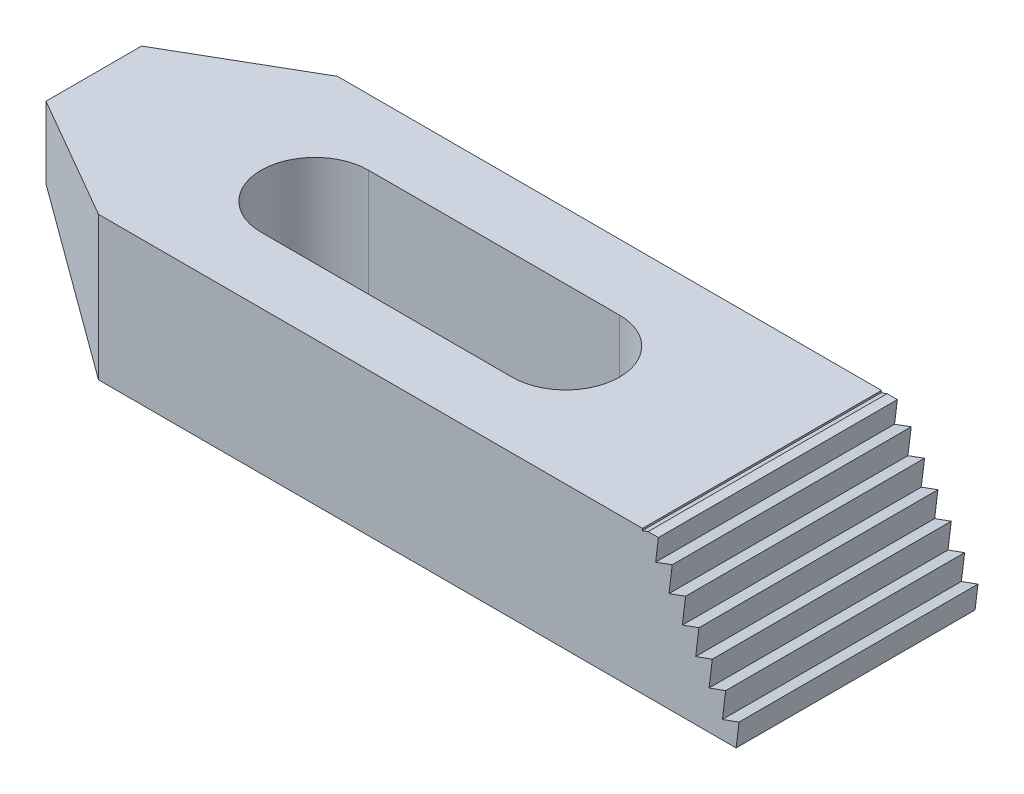
ISO-10303-21;
HEADER;
FILE_DESCRIPTION(('STEP AP214'),'2;1');
FILE_NAME('part.step','',(''),(''),'','','');
FILE_SCHEMA(('AUTOMOTIVE_DESIGN { 1 0 10303 214 1 1 1 1 }'));
ENDSEC;
DATA;
#1=APPLICATION_CONTEXT('core data for automotive mechanical design processes');
#2=APPLICATION_PROTOCOL_DEFINITION('international standard','automotive_design',2000,#1);
#3=PRODUCT_CONTEXT('',#1,'mechanical');
#4=PRODUCT('Part','Part','',(#3));
#5=PRODUCT_RELATED_PRODUCT_CATEGORY('part','',(#4));
#6=PRODUCT_DEFINITION_FORMATION('','',#4);
#7=PRODUCT_DEFINITION_CONTEXT('part definition',#1,'design');
#8=PRODUCT_DEFINITION('design','',#6,#7);
#9=PRODUCT_DEFINITION_SHAPE('','',#8);
#10=(LENGTH_UNIT() NAMED_UNIT(*) SI_UNIT(.MILLI.,.METRE.));
#11=(NAMED_UNIT(*) PLANE_ANGLE_UNIT() SI_UNIT($,.RADIAN.));
#12=(NAMED_UNIT(*) SI_UNIT($,.STERADIAN.) SOLID_ANGLE_UNIT());
#13=UNCERTAINTY_MEASURE_WITH_UNIT(LENGTH_MEASURE(1.E-05),#10,'distance_accuracy_value','');
#14=(GEOMETRIC_REPRESENTATION_CONTEXT(3) GLOBAL_UNCERTAINTY_ASSIGNED_CONTEXT((#13)) GLOBAL_UNIT_ASSIGNED_CONTEXT((#10,
#11,#12)) REPRESENTATION_CONTEXT('',''));
#15=CARTESIAN_POINT('',(0.,0.,0.));
#16=DIRECTION('',(0.,0.,1.));
#17=DIRECTION('',(1.,0.,0.));
#18=AXIS2_PLACEMENT_3D('',#15,#16,#17);
#19=CARTESIAN_POINT('',(16.5051291881549,9.24292269619013,25.4000000000063));
#20=DIRECTION('',(-0.34202014332444,0.939692620786356,6.42338198795155E-13));
#21=DIRECTION('',(0.939692620786356,0.34202014332444,2.33755980176246E-13));
#22=AXIS2_PLACEMENT_3D('',#19,#20,#21);
#23=PLANE('',#22);
#24=DIRECTION('',(0.,-6.83456763406199E-13,1.));
#25=VECTOR('',#24,1.);
#26=CARTESIAN_POINT('',(17.2801302107477,9.52499999994403,17.4625000000065));
#27=LINE('',#26,#25);
#28=CARTESIAN_POINT('',(17.2801302107477,9.52499999996031,-6.34999999999348));
#29=VERTEX_POINT('',#28);
#30=CARTESIAN_POINT('',(17.2801302107477,9.52499999993861,25.4000000000065));
#31=VERTEX_POINT('',#30);
#32=EDGE_CURVE('E11',#29,#31,#27,.T.);
#33=ORIENTED_EDGE('',*,*,#32,.F.);
#34=DIRECTION('',(0.939692620786356,0.34202014332444,2.33755980176246E-13));
#35=VECTOR('',#34,1.);
#36=CARTESIAN_POINT('',(-1.7323163683359,2.60503536462578,-6.34999999999821));
#37=LINE('',#36,#35);
#38=CARTESIAN_POINT('',(16.505129188155,9.24292269621183,-6.34999999999368));
#39=VERTEX_POINT('',#38);
#40=EDGE_CURVE('E55',#39,#29,#37,.T.);
#41=ORIENTED_EDGE('',*,*,#40,.F.);
#42=DIRECTION('',(0.,6.83566958165254E-13,-1.));
#43=VECTOR('',#42,1.);
#44=CARTESIAN_POINT('',(16.5051291881549,9.24292269619013,25.4000000000063));
#45=LINE('',#44,#43);
#46=CARTESIAN_POINT('',(16.5051291881549,9.24292269619013,25.4000000000063));
#47=VERTEX_POINT('',#46);
#48=EDGE_CURVE('E267',#47,#39,#45,.T.);
#49=ORIENTED_EDGE('',*,*,#48,.F.);
#50=DIRECTION('',(-0.939692620786356,-0.34202014332444,-2.33755980176246E-13));
#51=VECTOR('',#50,1.);
#52=CARTESIAN_POINT('',(-1.7323163683359,2.60503536460409,25.4000000000018));
#53=LINE('',#52,#51);
#54=EDGE_CURVE('E275',#31,#47,#53,.T.);
#55=ORIENTED_EDGE('',*,*,#54,.F.);
#56=EDGE_LOOP('',(#33,#41,#49,#55));
#57=FACE_BOUND('',#56,.T.);
#58=ADVANCED_FACE('F36',(#57),#23,.T.);
#59=CARTESIAN_POINT('',(-21.4375999999877,9.52500000000012,9.52500000000652));
#60=DIRECTION('',(1.30845681511893E-12,1.,6.83456763406198E-13));
#61=DIRECTION('',(1.,-1.30845681511893E-12,0.));
#62=AXIS2_PLACEMENT_3D('',#59,#60,#61);
#63=PLANE('',#62);
#64=ORIENTED_EDGE('',*,*,#32,.T.);
#65=DIRECTION('',(1.,-1.30845681511893E-12,0.));
#66=VECTOR('',#65,1.);
#67=CARTESIAN_POINT('',(-21.4375999999877,9.52499999998927,25.4000000000065));
#68=LINE('',#67,#66);
#69=CARTESIAN_POINT('',(18.6500269229382,9.52499999993682,25.4000000000065));
#70=VERTEX_POINT('',#69);
#71=EDGE_CURVE('E46',#31,#70,#68,.T.);
#72=ORIENTED_EDGE('',*,*,#71,.T.);
#73=DIRECTION('',(0.,6.83456763406198E-13,-1.));
#74=VECTOR('',#73,1.);
#75=CARTESIAN_POINT('',(18.6500269229382,9.52499999994224,17.4625000000065));
#76=LINE('',#75,#74);
#77=CARTESIAN_POINT('',(18.6500269229382,9.52499999995852,-6.34999999999348));
#78=VERTEX_POINT('',#77);
#79=EDGE_CURVE('E365',#70,#78,#76,.T.);
#80=ORIENTED_EDGE('',*,*,#79,.T.);
#81=DIRECTION('',(-1.,1.30845681511893E-12,0.));
#82=VECTOR('',#81,1.);
#83=CARTESIAN_POINT('',(-21.4375999999877,9.52500000001097,-6.34999999999348));
#84=LINE('',#83,#82);
#85=EDGE_CURVE('E293',#78,#29,#84,.T.);
#86=ORIENTED_EDGE('',*,*,#85,.T.);
#87=EDGE_LOOP('',(#64,#72,#80,#86));
#88=FACE_BOUND('',#87,.T.);
#89=ADVANCED_FACE('F461',(#88),#63,.T.);
#90=CARTESIAN_POINT('',(-21.4376000000001,1.09686565386014E-11,-6.34999999999999));
#91=DIRECTION('',(0.,6.83456763406198E-13,-1.));
#92=DIRECTION('',(-1.30845681511893E-12,-1.,-6.83456763406198E-13));
#93=AXIS2_PLACEMENT_3D('',#90,#91,#92);
#94=PLANE('',#93);
#95=DIRECTION('',(-0.121869343406446,-0.992546151641163,-6.78362380331947E-13));
#96=VECTOR('',#95,1.);
#97=CARTESIAN_POINT('',(15.8814812839948,4.1637181157066,-6.34999999999715));
#98=LINE('',#97,#96);
#99=CARTESIAN_POINT('',(16.5397639260369,9.52499999996128,-6.34999999999348));
#100=VERTEX_POINT('',#99);
#101=EDGE_CURVE('E291',#100,#39,#98,.T.);
#102=ORIENTED_EDGE('',*,*,#101,.T.);
#103=ORIENTED_EDGE('',*,*,#40,.T.);
#104=ORIENTED_EDGE('',*,*,#85,.F.);
#105=DIRECTION('',(-0.121869343406446,-0.992546151641163,-6.78362380331947E-13));
#106=VECTOR('',#105,1.);
#107=CARTESIAN_POINT('',(17.8082992052758,2.66967786936163,-6.34999999999817));
#108=LINE('',#107,#106);
#109=CARTESIAN_POINT('',(18.2798439486606,6.51010161573673,-6.34999999999554));
#110=VERTEX_POINT('',#109);
#111=EDGE_CURVE('E332',#78,#110,#108,.T.);
#112=ORIENTED_EDGE('',*,*,#111,.T.);
#113=DIRECTION('',(0.939692620786356,0.34202014332444,2.33755980176246E-13));
#114=VECTOR('',#113,1.);
#115=CARTESIAN_POINT('',(-0.302002010555448,-0.253137211110106,-6.35000000000016));
#116=LINE('',#115,#114);
#117=CARTESIAN_POINT('',(20.4888261974633,7.31410540232003,-6.34999999999499));
#118=VERTEX_POINT('',#117);
#119=EDGE_CURVE('E329',#110,#118,#116,.T.);
#120=ORIENTED_EDGE('',*,*,#119,.T.);
#121=DIRECTION('',(-0.121869343406446,-0.992546151641163,-6.78362380331947E-13));
#122=VECTOR('',#121,1.);
#123=CARTESIAN_POINT('',(19.7351171265566,1.17563762301668,-6.34999999999919));
#124=LINE('',#123,#122);
#125=CARTESIAN_POINT('',(20.0545587091662,3.77728053526163,-6.34999999999741));
#126=VERTEX_POINT('',#125);
#127=EDGE_CURVE('E261',#118,#126,#124,.T.);
#128=ORIENTED_EDGE('',*,*,#127,.T.);
#129=DIRECTION('',(0.939692620786356,0.34202014332444,2.33755980176246E-13));
#130=VECTOR('',#129,1.);
#131=CARTESIAN_POINT('',(1.12831234722491,-3.11130978684596,-6.35000000000212));
#132=LINE('',#131,#130);
#133=CARTESIAN_POINT('',(22.2635409579689,4.58128432184492,-6.34999999999686));
#134=VERTEX_POINT('',#133);
#135=EDGE_CURVE('E258',#126,#134,#132,.T.);
#136=ORIENTED_EDGE('',*,*,#135,.T.);
#137=DIRECTION('',(-0.121869343406446,-0.992546151641163,-6.78362380331947E-13));
#138=VECTOR('',#137,1.);
#139=CARTESIAN_POINT('',(21.6619350478376,-0.318402623328296,-6.35000000000021));
#140=LINE('',#139,#138);
#141=CARTESIAN_POINT('',(21.8292734696719,1.04445945478652,-6.34999999999928));
#142=VERTEX_POINT('',#141);
#143=EDGE_CURVE('E262',#134,#142,#140,.T.);
#144=ORIENTED_EDGE('',*,*,#143,.T.);
#145=DIRECTION('',(0.939692620786356,0.34202014332444,2.33755980176246E-13));
#146=VECTOR('',#145,1.);
#147=CARTESIAN_POINT('',(2.55862670500528,-5.96948236258193,-6.35000000000407));
#148=LINE('',#147,#146);
#149=CARTESIAN_POINT('',(24.0382557184746,1.84846324136981,-6.34999999999873));
#150=VERTEX_POINT('',#149);
#151=EDGE_CURVE('E278',#142,#150,#148,.T.);
#152=ORIENTED_EDGE('',*,*,#151,.T.);
#153=DIRECTION('',(-0.121869343406446,-0.992546151641163,-6.78362380331947E-13));
#154=VECTOR('',#153,1.);
#155=CARTESIAN_POINT('',(23.5887529691185,-1.81244286967325,-6.35000000000123));
#156=LINE('',#155,#154);
#157=CARTESIAN_POINT('',(23.6039882301777,-1.68836162568857,-6.35000000000115));
#158=VERTEX_POINT('',#157);
#159=EDGE_CURVE('E281',#150,#158,#156,.T.);
#160=ORIENTED_EDGE('',*,*,#159,.T.);
#161=DIRECTION('',(0.939692620786356,0.34202014332444,2.33755980176246E-13));
#162=VECTOR('',#161,1.);
#163=CARTESIAN_POINT('',(3.98894106278563,-8.8276549383178,-6.35000000000602));
#164=LINE('',#163,#162);
#165=CARTESIAN_POINT('',(25.8129704789802,-0.884357839105256,-6.3500000000006));
#166=VERTEX_POINT('',#165);
#167=EDGE_CURVE('E313',#158,#166,#164,.T.);
#168=ORIENTED_EDGE('',*,*,#167,.T.);
#169=DIRECTION('',(-0.121869343406446,-0.992546151641163,-6.78362380331947E-13));
#170=VECTOR('',#169,1.);
#171=CARTESIAN_POINT('',(25.5155708903995,-3.30648311601817,-6.35000000000225));
#172=LINE('',#171,#170);
#173=CARTESIAN_POINT('',(25.3787029906833,-4.42118270616369,-6.35000000000301));
#174=VERTEX_POINT('',#173);
#175=EDGE_CURVE('E316',#166,#174,#172,.T.);
#176=ORIENTED_EDGE('',*,*,#175,.T.);
#177=DIRECTION('',(0.939692620786356,0.34202014332444,2.33755980176246E-13));
#178=VECTOR('',#177,1.);
#179=CARTESIAN_POINT('',(5.41925542056609,-11.6858275140537,-6.35000000000798));
#180=LINE('',#179,#178);
#181=CARTESIAN_POINT('',(27.587685239486,-3.61717891958038,-6.35000000000247));
#182=VERTEX_POINT('',#181);
#183=EDGE_CURVE('E401',#174,#182,#180,.T.);
#184=ORIENTED_EDGE('',*,*,#183,.T.);
#185=DIRECTION('',(-0.121869343406446,-0.992546151641163,-6.78362380331947E-13));
#186=VECTOR('',#185,1.);
#187=CARTESIAN_POINT('',(27.4423888116804,-4.80052336236319,-6.35000000000327));
#188=LINE('',#187,#186);
#189=CARTESIAN_POINT('',(27.153417751189,-7.15400378663881,-6.35000000000488));
#190=VERTEX_POINT('',#189);
#191=EDGE_CURVE('E218',#182,#190,#188,.T.);
#192=ORIENTED_EDGE('',*,*,#191,.T.);
#193=DIRECTION('',(0.939692620786356,0.34202014332444,2.33755980176246E-13));
#194=VECTOR('',#193,1.);
#195=CARTESIAN_POINT('',(6.84956977834645,-14.5440000897895,-6.35000000000993));
#196=LINE('',#195,#194);
#197=CARTESIAN_POINT('',(29.3623999999916,-6.3500000000555,-6.35000000000433));
#198=VERTEX_POINT('',#197);
#199=EDGE_CURVE('E230',#190,#198,#196,.T.);
#200=ORIENTED_EDGE('',*,*,#199,.T.);
#201=DIRECTION('',(-0.121869343406446,-0.992546151641163,-6.78362380331947E-13));
#202=VECTOR('',#201,1.);
#203=CARTESIAN_POINT('',(29.3692067329612,-6.29456360870811,-6.35000000000429));
#204=LINE('',#203,#202);
#205=CARTESIAN_POINT('',(28.9725590191207,-9.52500000005499,-6.3500000000065));
#206=VERTEX_POINT('',#205);
#207=EDGE_CURVE('E233',#198,#206,#204,.T.);
#208=ORIENTED_EDGE('',*,*,#207,.T.);
#209=DIRECTION('',(1.,-1.30845681511893E-12,0.));
#210=VECTOR('',#209,1.);
#211=CARTESIAN_POINT('',(-21.4376000000126,-9.52499999998903,-6.3500000000065));
#212=LINE('',#211,#210);
#213=CARTESIAN_POINT('',(-55.7398160579191,-9.52499999994415,-6.3500000000065));
#214=VERTEX_POINT('',#213);
#215=EDGE_CURVE('E242',#214,#206,#212,.T.);
#216=ORIENTED_EDGE('',*,*,#215,.F.);
#217=DIRECTION('',(1.30845681511893E-12,1.,6.83456763406198E-13));
#218=VECTOR('',#217,1.);
#219=CARTESIAN_POINT('',(-55.7398160579066,5.58511570325493E-11,-6.34999999999999));
#220=LINE('',#219,#218);
#221=CARTESIAN_POINT('',(-55.7398160578942,9.52500000005585,-6.34999999999348));
#222=VERTEX_POINT('',#221);
#223=EDGE_CURVE('E269',#214,#222,#220,.T.);
#224=ORIENTED_EDGE('',*,*,#223,.T.);
#225=DIRECTION('',(-1.,1.30845681511893E-12,0.));
#226=VECTOR('',#225,1.);
#227=CARTESIAN_POINT('',(-21.4375999999877,9.52500000001097,-6.34999999999348));
#228=LINE('',#227,#226);
#229=EDGE_CURVE('E234',#100,#222,#228,.T.);
#230=ORIENTED_EDGE('',*,*,#229,.F.);
#231=EDGE_LOOP('',(#102,#103,#104,#112,#120,#128,#136,#144,#152,#160,#168,#176,#184,#192,#200,
#208,#216,#224,#230));
#232=FACE_BOUND('',#231,.T.);
#233=ADVANCED_FACE('F373',(#232),#94,.T.);
#234=CARTESIAN_POINT('',(16.9393966764519,12.7797475632485,25.4000000000087));
#235=DIRECTION('',(0.992546151641163,-0.121869343406446,0.));
#236=DIRECTION('',(-0.121869343406446,-0.992546151641163,-6.78362380331947E-13));
#237=AXIS2_PLACEMENT_3D('',#234,#235,#236);
#238=PLANE('',#237);
#239=DIRECTION('',(0.,6.83456763406198E-13,-1.));
#240=VECTOR('',#239,1.);
#241=CARTESIAN_POINT('',(16.5397639260369,9.524999999945,17.4625000000065));
#242=LINE('',#241,#240);
#243=CARTESIAN_POINT('',(16.5397639260369,9.52499999993958,25.4000000000065));
#244=VERTEX_POINT('',#243);
#245=EDGE_CURVE('E237',#244,#100,#242,.T.);
#246=ORIENTED_EDGE('',*,*,#245,.F.);
#247=DIRECTION('',(0.121869343406446,0.992546151641163,6.78362380331947E-13));
#248=VECTOR('',#247,1.);
#249=CARTESIAN_POINT('',(15.8814812839948,4.1637181156849,25.4000000000029));
#250=LINE('',#249,#248);
#251=EDGE_CURVE('E270',#47,#244,#250,.T.);
#252=ORIENTED_EDGE('',*,*,#251,.F.);
#253=ORIENTED_EDGE('',*,*,#48,.T.);
#254=ORIENTED_EDGE('',*,*,#101,.F.);
#255=EDGE_LOOP('',(#246,#252,#253,#254));
#256=FACE_BOUND('',#255,.T.);
#257=ADVANCED_FACE('F387',(#256),#238,.T.);
#258=CARTESIAN_POINT('',(-21.4376000000001,-1.07309994223925E-11,25.4));
#259=DIRECTION('',(0.,-6.83456763406198E-13,1.));
#260=DIRECTION('',(1.30845681511893E-12,1.,6.83456763406198E-13));
#261=AXIS2_PLACEMENT_3D('',#258,#259,#260);
#262=PLANE('',#261);
#263=ORIENTED_EDGE('',*,*,#251,.T.);
#264=DIRECTION('',(1.,-1.30845681511893E-12,0.));
#265=VECTOR('',#264,1.);
#266=CARTESIAN_POINT('',(-21.4375999999877,9.52499999998927,25.4000000000065));
#267=LINE('',#266,#265);
#268=CARTESIAN_POINT('',(-55.739816057894,9.52500000003415,25.4000000000065));
#269=VERTEX_POINT('',#268);
#270=EDGE_CURVE('E299',#269,#244,#267,.T.);
#271=ORIENTED_EDGE('',*,*,#270,.F.);
#272=DIRECTION('',(-1.30845681511893E-12,-1.,-6.83456763406198E-13));
#273=VECTOR('',#272,1.);
#274=CARTESIAN_POINT('',(-55.7398160579065,3.41515010715554E-11,25.4));
#275=LINE('',#274,#273);
#276=CARTESIAN_POINT('',(-55.739816057919,-9.52499999996585,25.3999999999935));
#277=VERTEX_POINT('',#276);
#278=EDGE_CURVE('E317',#269,#277,#275,.T.);
#279=ORIENTED_EDGE('',*,*,#278,.T.);
#280=DIRECTION('',(-1.,1.30845681511893E-12,0.));
#281=VECTOR('',#280,1.);
#282=CARTESIAN_POINT('',(-21.4376000000126,-9.52500000001073,25.3999999999935));
#283=LINE('',#282,#281);
#284=CARTESIAN_POINT('',(28.9725590191207,-9.52500000007669,25.3999999999935));
#285=VERTEX_POINT('',#284);
#286=EDGE_CURVE('E312',#285,#277,#283,.T.);
#287=ORIENTED_EDGE('',*,*,#286,.F.);
#288=DIRECTION('',(0.121869343406446,0.992546151641163,6.78362380331947E-13));
#289=VECTOR('',#288,1.);
#290=CARTESIAN_POINT('',(29.3692067329612,-6.29456360872981,25.3999999999957));
#291=LINE('',#290,#289);
#292=CARTESIAN_POINT('',(29.3623999999916,-6.3500000000772,25.3999999999957));
#293=VERTEX_POINT('',#292);
#294=EDGE_CURVE('E308',#285,#293,#291,.T.);
#295=ORIENTED_EDGE('',*,*,#294,.T.);
#296=DIRECTION('',(-0.939692620786356,-0.34202014332444,-2.33755980176246E-13));
#297=VECTOR('',#296,1.);
#298=CARTESIAN_POINT('',(6.84956977834645,-14.5440000898112,25.3999999999901));
#299=LINE('',#298,#297);
#300=CARTESIAN_POINT('',(27.1534177511889,-7.15400378666051,25.3999999999951));
#301=VERTEX_POINT('',#300);
#302=EDGE_CURVE('E212',#293,#301,#299,.T.);
#303=ORIENTED_EDGE('',*,*,#302,.T.);
#304=DIRECTION('',(0.121869343406446,0.992546151641163,6.78362380331947E-13));
#305=VECTOR('',#304,1.);
#306=CARTESIAN_POINT('',(27.4423888116804,-4.80052336238489,25.3999999999967));
#307=LINE('',#306,#305);
#308=CARTESIAN_POINT('',(27.587685239486,-3.61717891960208,25.3999999999975));
#309=VERTEX_POINT('',#308);
#310=EDGE_CURVE('E204',#301,#309,#307,.T.);
#311=ORIENTED_EDGE('',*,*,#310,.T.);
#312=DIRECTION('',(-0.939692620786356,-0.34202014332444,-2.33755980176246E-13));
#313=VECTOR('',#312,1.);
#314=CARTESIAN_POINT('',(5.41925542056609,-11.6858275140754,25.399999999992));
#315=LINE('',#314,#313);
#316=CARTESIAN_POINT('',(25.3787029906833,-4.42118270618539,25.399999999997));
#317=VERTEX_POINT('',#316);
#318=EDGE_CURVE('E194',#309,#317,#315,.T.);
#319=ORIENTED_EDGE('',*,*,#318,.T.);
#320=DIRECTION('',(0.121869343406446,0.992546151641163,6.78362380331947E-13));
#321=VECTOR('',#320,1.);
#322=CARTESIAN_POINT('',(25.5155708903995,-3.30648311603987,25.3999999999977));
#323=LINE('',#322,#321);
#324=CARTESIAN_POINT('',(25.8129704789802,-0.884357839126956,25.3999999999994));
#325=VERTEX_POINT('',#324);
#326=EDGE_CURVE('E205',#317,#325,#323,.T.);
#327=ORIENTED_EDGE('',*,*,#326,.T.);
#328=DIRECTION('',(-0.939692620786356,-0.34202014332444,-2.33755980176246E-13));
#329=VECTOR('',#328,1.);
#330=CARTESIAN_POINT('',(3.98894106278563,-8.8276549383395,25.399999999994));
#331=LINE('',#330,#329);
#332=CARTESIAN_POINT('',(23.6039882301776,-1.68836162571027,25.3999999999989));
#333=VERTEX_POINT('',#332);
#334=EDGE_CURVE('E333',#325,#333,#331,.T.);
#335=ORIENTED_EDGE('',*,*,#334,.T.);
#336=DIRECTION('',(0.121869343406446,0.992546151641163,6.78362380331947E-13));
#337=VECTOR('',#336,1.);
#338=CARTESIAN_POINT('',(23.5887529691185,-1.81244286969495,25.3999999999988));
#339=LINE('',#338,#337);
#340=CARTESIAN_POINT('',(24.0382557184746,1.84846324134812,25.4000000000013));
#341=VERTEX_POINT('',#340);
#342=EDGE_CURVE('E297',#333,#341,#339,.T.);
#343=ORIENTED_EDGE('',*,*,#342,.T.);
#344=DIRECTION('',(-0.939692620786356,-0.34202014332444,-2.33755980176246E-13));
#345=VECTOR('',#344,1.);
#346=CARTESIAN_POINT('',(2.55862670500528,-5.96948236260363,25.3999999999959));
#347=LINE('',#346,#345);
#348=CARTESIAN_POINT('',(21.8292734696719,1.04445945476482,25.4000000000007));
#349=VERTEX_POINT('',#348);
#350=EDGE_CURVE('E295',#341,#349,#347,.T.);
#351=ORIENTED_EDGE('',*,*,#350,.T.);
#352=DIRECTION('',(0.121869343406446,0.992546151641163,6.78362380331947E-13));
#353=VECTOR('',#352,1.);
#354=CARTESIAN_POINT('',(21.6619350478376,-0.318402623349995,25.3999999999998));
#355=LINE('',#354,#353);
#356=CARTESIAN_POINT('',(22.2635409579689,4.58128432182322,25.4000000000031));
#357=VERTEX_POINT('',#356);
#358=EDGE_CURVE('E256',#349,#357,#355,.T.);
#359=ORIENTED_EDGE('',*,*,#358,.T.);
#360=DIRECTION('',(-0.939692620786356,-0.34202014332444,-2.33755980176246E-13));
#361=VECTOR('',#360,1.);
#362=CARTESIAN_POINT('',(1.12831234722491,-3.11130978686766,25.3999999999979));
#363=LINE('',#362,#361);
#364=CARTESIAN_POINT('',(20.0545587091662,3.77728053523992,25.4000000000026));
#365=VERTEX_POINT('',#364);
#366=EDGE_CURVE('E253',#357,#365,#363,.T.);
#367=ORIENTED_EDGE('',*,*,#366,.T.);
#368=DIRECTION('',(0.121869343406446,0.992546151641163,6.78362380331947E-13));
#369=VECTOR('',#368,1.);
#370=CARTESIAN_POINT('',(19.7351171265566,1.17563762299498,25.4000000000008));
#371=LINE('',#370,#369);
#372=CARTESIAN_POINT('',(20.4888261974633,7.31410540229832,25.400000000005));
#373=VERTEX_POINT('',#372);
#374=EDGE_CURVE('E257',#365,#373,#371,.T.);
#375=ORIENTED_EDGE('',*,*,#374,.T.);
#376=DIRECTION('',(-0.939692620786356,-0.34202014332444,-2.33755980176246E-13));
#377=VECTOR('',#376,1.);
#378=CARTESIAN_POINT('',(-0.302002010555448,-0.253137211131805,25.3999999999998));
#379=LINE('',#378,#377);
#380=CARTESIAN_POINT('',(18.2798439486606,6.51010161571503,25.4000000000045));
#381=VERTEX_POINT('',#380);
#382=EDGE_CURVE('E274',#373,#381,#379,.T.);
#383=ORIENTED_EDGE('',*,*,#382,.T.);
#384=DIRECTION('',(0.121869343406446,0.992546151641163,6.78362380331947E-13));
#385=VECTOR('',#384,1.);
#386=CARTESIAN_POINT('',(17.8082992052758,2.66967786933993,25.4000000000018));
#387=LINE('',#386,#385);
#388=EDGE_CURVE('E271',#381,#70,#387,.T.);
#389=ORIENTED_EDGE('',*,*,#388,.T.);
#390=ORIENTED_EDGE('',*,*,#71,.F.);
#391=ORIENTED_EDGE('',*,*,#54,.T.);
#392=EDGE_LOOP('',(#263,#271,#279,#287,#295,#303,#311,#319,#327,#335,#343,#351,#359,#367,#375,
#383,#389,#390,#391));
#393=FACE_BOUND('',#392,.T.);
#394=ADVANCED_FACE('F210',(#393),#262,.T.);
#395=CARTESIAN_POINT('',(18.7141114369575,10.0469264827734,25.4000000000069));
#396=DIRECTION('',(0.992546151641163,-0.121869343406446,0.));
#397=DIRECTION('',(-0.121869343406446,-0.992546151641163,-6.78362380331947E-13));
#398=AXIS2_PLACEMENT_3D('',#395,#396,#397);
#399=PLANE('',#398);
#400=ORIENTED_EDGE('',*,*,#79,.F.);
#401=ORIENTED_EDGE('',*,*,#388,.F.);
#402=DIRECTION('',(0.,6.83566958165254E-13,-1.));
#403=VECTOR('',#402,1.);
#404=CARTESIAN_POINT('',(18.2798439486606,6.51010161571503,25.4000000000045));
#405=LINE('',#404,#403);
#406=EDGE_CURVE('E251',#381,#110,#405,.T.);
#407=ORIENTED_EDGE('',*,*,#406,.T.);
#408=ORIENTED_EDGE('',*,*,#111,.F.);
#409=EDGE_LOOP('',(#400,#401,#407,#408));
#410=FACE_BOUND('',#409,.T.);
#411=ADVANCED_FACE('F459',(#410),#399,.T.);
#412=CARTESIAN_POINT('',(18.2798439486606,6.51010161571503,25.4000000000045));
#413=DIRECTION('',(-0.34202014332444,0.939692620786356,6.42338198795155E-13));
#414=DIRECTION('',(0.939692620786356,0.34202014332444,2.33755980176246E-13));
#415=AXIS2_PLACEMENT_3D('',#412,#413,#414);
#416=PLANE('',#415);
#417=DIRECTION('',(0.,6.83608752766218E-13,-1.));
#418=VECTOR('',#417,1.);
#419=CARTESIAN_POINT('',(20.4888261974633,7.31410540230375,17.462500000005));
#420=LINE('',#419,#418);
#421=EDGE_CURVE('E249',#373,#118,#420,.T.);
#422=ORIENTED_EDGE('',*,*,#421,.T.);
#423=ORIENTED_EDGE('',*,*,#119,.F.);
#424=ORIENTED_EDGE('',*,*,#406,.F.);
#425=ORIENTED_EDGE('',*,*,#382,.F.);
#426=EDGE_LOOP('',(#422,#423,#424,#425));
#427=FACE_BOUND('',#426,.T.);
#428=ADVANCED_FACE('F457',(#427),#416,.T.);
#429=CARTESIAN_POINT('',(20.4888261974633,7.31410540229832,25.400000000005));
#430=DIRECTION('',(0.992546151641163,-0.121869343406446,0.));
#431=DIRECTION('',(-0.121869343406446,-0.992546151641163,-6.78362380331947E-13));
#432=AXIS2_PLACEMENT_3D('',#429,#430,#431);
#433=PLANE('',#432);
#434=ORIENTED_EDGE('',*,*,#127,.F.);
#435=ORIENTED_EDGE('',*,*,#421,.F.);
#436=ORIENTED_EDGE('',*,*,#374,.F.);
#437=DIRECTION('',(0.,6.83566958165254E-13,-1.));
#438=VECTOR('',#437,1.);
#439=CARTESIAN_POINT('',(20.0545587091662,3.77728053523992,25.4000000000026));
#440=LINE('',#439,#438);
#441=EDGE_CURVE('E252',#365,#126,#440,.T.);
#442=ORIENTED_EDGE('',*,*,#441,.T.);
#443=EDGE_LOOP('',(#434,#435,#436,#442));
#444=FACE_BOUND('',#443,.T.);
#445=ADVANCED_FACE('F452',(#444),#433,.T.);
#446=CARTESIAN_POINT('',(20.0545587091662,3.77728053523992,25.4000000000026));
#447=DIRECTION('',(-0.34202014332444,0.939692620786356,6.42338198795155E-13));
#448=DIRECTION('',(0.939692620786356,0.34202014332444,2.33755980176246E-13));
#449=AXIS2_PLACEMENT_3D('',#446,#447,#448);
#450=PLANE('',#449);
#451=DIRECTION('',(0.,6.83608752766218E-13,-1.));
#452=VECTOR('',#451,1.);
#453=CARTESIAN_POINT('',(22.2635409579689,4.58128432182864,17.4625000000031));
#454=LINE('',#453,#452);
#455=EDGE_CURVE('E351',#357,#134,#454,.T.);
#456=ORIENTED_EDGE('',*,*,#455,.T.);
#457=ORIENTED_EDGE('',*,*,#135,.F.);
#458=ORIENTED_EDGE('',*,*,#441,.F.);
#459=ORIENTED_EDGE('',*,*,#366,.F.);
#460=EDGE_LOOP('',(#456,#457,#458,#459));
#461=FACE_BOUND('',#460,.T.);
#462=ADVANCED_FACE('F447',(#461),#450,.T.);
#463=CARTESIAN_POINT('',(22.2635409579689,4.58128432182322,25.4000000000031));
#464=DIRECTION('',(0.992546151641163,-0.121869343406446,0.));
#465=DIRECTION('',(-0.121869343406446,-0.992546151641163,-6.78362380331947E-13));
#466=AXIS2_PLACEMENT_3D('',#463,#464,#465);
#467=PLANE('',#466);
#468=ORIENTED_EDGE('',*,*,#143,.F.);
#469=ORIENTED_EDGE('',*,*,#455,.F.);
#470=ORIENTED_EDGE('',*,*,#358,.F.);
#471=DIRECTION('',(0.,6.83566958165254E-13,-1.));
#472=VECTOR('',#471,1.);
#473=CARTESIAN_POINT('',(21.8292734696719,1.04445945476482,25.4000000000007));
#474=LINE('',#473,#472);
#475=EDGE_CURVE('E228',#349,#142,#474,.T.);
#476=ORIENTED_EDGE('',*,*,#475,.T.);
#477=EDGE_LOOP('',(#468,#469,#470,#476));
#478=FACE_BOUND('',#477,.T.);
#479=ADVANCED_FACE('F507',(#478),#467,.T.);
#480=CARTESIAN_POINT('',(21.8292734696719,1.04445945476482,25.4000000000007));
#481=DIRECTION('',(-0.34202014332444,0.939692620786356,6.42338198795155E-13));
#482=DIRECTION('',(0.939692620786356,0.34202014332444,2.33755980176246E-13));
#483=AXIS2_PLACEMENT_3D('',#480,#481,#482);
#484=PLANE('',#483);
#485=DIRECTION('',(0.,6.83608752766218E-13,-1.));
#486=VECTOR('',#485,1.);
#487=CARTESIAN_POINT('',(24.0382557184746,1.84846324135354,17.4625000000013));
#488=LINE('',#487,#486);
#489=EDGE_CURVE('E282',#341,#150,#488,.T.);
#490=ORIENTED_EDGE('',*,*,#489,.T.);
#491=ORIENTED_EDGE('',*,*,#151,.F.);
#492=ORIENTED_EDGE('',*,*,#475,.F.);
#493=ORIENTED_EDGE('',*,*,#350,.F.);
#494=EDGE_LOOP('',(#490,#491,#492,#493));
#495=FACE_BOUND('',#494,.T.);
#496=ADVANCED_FACE('F466',(#495),#484,.T.);
#497=CARTESIAN_POINT('',(24.0382557184746,1.84846324134812,25.4000000000013));
#498=DIRECTION('',(0.992546151641163,-0.121869343406446,0.));
#499=DIRECTION('',(-0.121869343406446,-0.992546151641163,-6.78362380331947E-13));
#500=AXIS2_PLACEMENT_3D('',#497,#498,#499);
#501=PLANE('',#500);
#502=ORIENTED_EDGE('',*,*,#159,.F.);
#503=ORIENTED_EDGE('',*,*,#489,.F.);
#504=ORIENTED_EDGE('',*,*,#342,.F.);
#505=DIRECTION('',(0.,6.83566958165254E-13,-1.));
#506=VECTOR('',#505,1.);
#507=CARTESIAN_POINT('',(23.6039882301776,-1.68836162571027,25.3999999999989));
#508=LINE('',#507,#506);
#509=EDGE_CURVE('E285',#333,#158,#508,.T.);
#510=ORIENTED_EDGE('',*,*,#509,.T.);
#511=EDGE_LOOP('',(#502,#503,#504,#510));
#512=FACE_BOUND('',#511,.T.);
#513=ADVANCED_FACE('F470',(#512),#501,.T.);
#514=CARTESIAN_POINT('',(23.6039882301776,-1.68836162571027,25.3999999999989));
#515=DIRECTION('',(-0.34202014332444,0.939692620786356,6.42338198795155E-13));
#516=DIRECTION('',(0.939692620786356,0.34202014332444,2.33755980176246E-13));
#517=AXIS2_PLACEMENT_3D('',#514,#515,#516);
#518=PLANE('',#517);
#519=DIRECTION('',(0.,6.83608752766218E-13,-1.));
#520=VECTOR('',#519,1.);
#521=CARTESIAN_POINT('',(25.8129704789802,-0.884357839121531,17.4624999999994));
#522=LINE('',#521,#520);
#523=EDGE_CURVE('E222',#325,#166,#522,.T.);
#524=ORIENTED_EDGE('',*,*,#523,.T.);
#525=ORIENTED_EDGE('',*,*,#167,.F.);
#526=ORIENTED_EDGE('',*,*,#509,.F.);
#527=ORIENTED_EDGE('',*,*,#334,.F.);
#528=EDGE_LOOP('',(#524,#525,#526,#527));
#529=FACE_BOUND('',#528,.T.);
#530=ADVANCED_FACE('F474',(#529),#518,.T.);
#531=CARTESIAN_POINT('',(25.8129704789802,-0.884357839126956,25.3999999999994));
#532=DIRECTION('',(0.992546151641163,-0.121869343406446,0.));
#533=DIRECTION('',(-0.121869343406446,-0.992546151641163,-6.78362380331947E-13));
#534=AXIS2_PLACEMENT_3D('',#531,#532,#533);
#535=PLANE('',#534);
#536=ORIENTED_EDGE('',*,*,#175,.F.);
#537=ORIENTED_EDGE('',*,*,#523,.F.);
#538=ORIENTED_EDGE('',*,*,#326,.F.);
#539=DIRECTION('',(0.,6.83566958165254E-13,-1.));
#540=VECTOR('',#539,1.);
#541=CARTESIAN_POINT('',(25.3787029906833,-4.42118270618539,25.399999999997));
#542=LINE('',#541,#540);
#543=EDGE_CURVE('E200',#317,#174,#542,.T.);
#544=ORIENTED_EDGE('',*,*,#543,.T.);
#545=EDGE_LOOP('',(#536,#537,#538,#544));
#546=FACE_BOUND('',#545,.T.);
#547=ADVANCED_FACE('F477',(#546),#535,.T.);
#548=CARTESIAN_POINT('',(25.3787029906833,-4.42118270618539,25.399999999997));
#549=DIRECTION('',(-0.34202014332444,0.939692620786356,6.42338198795155E-13));
#550=DIRECTION('',(0.939692620786356,0.34202014332444,2.33755980176246E-13));
#551=AXIS2_PLACEMENT_3D('',#548,#549,#550);
#552=PLANE('',#551);
#553=DIRECTION('',(0.,6.83608752766218E-13,-1.));
#554=VECTOR('',#553,1.);
#555=CARTESIAN_POINT('',(27.587685239486,-3.61717891959665,17.4624999999975));
#556=LINE('',#555,#554);
#557=EDGE_CURVE('E198',#309,#182,#556,.T.);
#558=ORIENTED_EDGE('',*,*,#557,.T.);
#559=ORIENTED_EDGE('',*,*,#183,.F.);
#560=ORIENTED_EDGE('',*,*,#543,.F.);
#561=ORIENTED_EDGE('',*,*,#318,.F.);
#562=EDGE_LOOP('',(#558,#559,#560,#561));
#563=FACE_BOUND('',#562,.T.);
#564=ADVANCED_FACE('F196',(#563),#552,.T.);
#565=CARTESIAN_POINT('',(27.587685239486,-3.61717891960208,25.3999999999975));
#566=DIRECTION('',(0.992546151641163,-0.121869343406446,0.));
#567=DIRECTION('',(-0.121869343406446,-0.992546151641163,-6.78362380331947E-13));
#568=AXIS2_PLACEMENT_3D('',#565,#566,#567);
#569=PLANE('',#568);
#570=ORIENTED_EDGE('',*,*,#191,.F.);
#571=ORIENTED_EDGE('',*,*,#557,.F.);
#572=ORIENTED_EDGE('',*,*,#310,.F.);
#573=DIRECTION('',(0.,6.83566958165254E-13,-1.));
#574=VECTOR('',#573,1.);
#575=CARTESIAN_POINT('',(27.1534177511889,-7.15400378666051,25.3999999999951));
#576=LINE('',#575,#574);
#577=EDGE_CURVE('E220',#301,#190,#576,.T.);
#578=ORIENTED_EDGE('',*,*,#577,.T.);
#579=EDGE_LOOP('',(#570,#571,#572,#578));
#580=FACE_BOUND('',#579,.T.);
#581=ADVANCED_FACE('F216',(#580),#569,.T.);
#582=CARTESIAN_POINT('',(27.1534177511889,-7.15400378666051,25.3999999999951));
#583=DIRECTION('',(-0.34202014332444,0.939692620786356,6.42338198795155E-13));
#584=DIRECTION('',(0.939692620786356,0.34202014332444,2.33755980176246E-13));
#585=AXIS2_PLACEMENT_3D('',#582,#583,#584);
#586=PLANE('',#585);
#587=DIRECTION('',(0.,-6.83456763406198E-13,1.));
#588=VECTOR('',#587,1.);
#589=CARTESIAN_POINT('',(29.3623999999916,-6.35000000006635,9.52499999999567));
#590=LINE('',#589,#588);
#591=EDGE_CURVE('E224',#198,#293,#590,.T.);
#592=ORIENTED_EDGE('',*,*,#591,.F.);
#593=ORIENTED_EDGE('',*,*,#199,.F.);
#594=ORIENTED_EDGE('',*,*,#577,.F.);
#595=ORIENTED_EDGE('',*,*,#302,.F.);
#596=EDGE_LOOP('',(#592,#593,#594,#595));
#597=FACE_BOUND('',#596,.T.);
#598=ADVANCED_FACE('F540',(#597),#586,.T.);
#599=CARTESIAN_POINT('',(29.3623999999916,-6.3500000000772,25.3999999999957));
#600=DIRECTION('',(0.992546151641163,-0.121869343406446,0.));
#601=DIRECTION('',(-0.121869343406446,-0.992546151641163,-6.78362380331947E-13));
#602=AXIS2_PLACEMENT_3D('',#599,#600,#601);
#603=PLANE('',#602);
#604=DIRECTION('',(0.,-6.83456763406198E-13,1.));
#605=VECTOR('',#604,1.);
#606=CARTESIAN_POINT('',(28.9725590191207,-9.52500000007127,17.4624999999935));
#607=LINE('',#606,#605);
#608=EDGE_CURVE('E309',#206,#285,#607,.T.);
#609=ORIENTED_EDGE('',*,*,#608,.F.);
#610=ORIENTED_EDGE('',*,*,#207,.F.);
#611=ORIENTED_EDGE('',*,*,#591,.T.);
#612=ORIENTED_EDGE('',*,*,#294,.F.);
#613=EDGE_LOOP('',(#609,#610,#611,#612));
#614=FACE_BOUND('',#613,.T.);
#615=ADVANCED_FACE('F549',(#614),#603,.T.);
#616=CARTESIAN_POINT('',(-21.4376000000126,-9.52499999999988,9.5249999999935));
#617=DIRECTION('',(-1.30845681511893E-12,-1.,-6.83456763406198E-13));
#618=DIRECTION('',(-1.,1.30845681511893E-12,0.));
#619=AXIS2_PLACEMENT_3D('',#616,#617,#618);
#620=PLANE('',#619);
#621=CARTESIAN_POINT('',(-42.8751999974726,-9.52499999997183,9.5249999974535));
#622=DIRECTION('',(1.30845681511893E-12,1.,6.83456763406198E-13));
#623=DIRECTION('',(-3.55871915565968E-10,-6.83456762940555E-13,1.));
#624=AXIS2_PLACEMENT_3D('',#621,#622,#623);
#625=CIRCLE('',#624,7.1374);
#626=CARTESIAN_POINT('',(-42.8752000000126,-9.52499999996695,2.3876000025335));
#627=VERTEX_POINT('',#626);
#628=CARTESIAN_POINT('',(-42.8752000000126,-9.52499999997671,16.6623999999935));
#629=VERTEX_POINT('',#628);
#630=EDGE_CURVE('E335',#627,#629,#625,.T.);
#631=ORIENTED_EDGE('',*,*,#630,.T.);
#632=DIRECTION('',(1.,-1.30845681511893E-12,0.));
#633=VECTOR('',#632,1.);
#634=CARTESIAN_POINT('',(-32.1564000000126,-9.52499999999073,16.6623999999935));
#635=LINE('',#634,#633);
#636=CARTESIAN_POINT('',(-9.52500000001257,-9.52500000002035,16.6623999974535));
#637=VERTEX_POINT('',#636);
#638=EDGE_CURVE('E265',#629,#637,#635,.T.);
#639=ORIENTED_EDGE('',*,*,#638,.T.);
#640=CARTESIAN_POINT('',(-9.52500000255258,-9.52500000001547,9.5249999974535));
#641=DIRECTION('',(1.30845681511893E-12,1.,6.83456763406198E-13));
#642=DIRECTION('',(1.,-1.30845681536216E-12,3.55872185901686E-10));
#643=AXIS2_PLACEMENT_3D('',#640,#641,#642);
#644=CIRCLE('',#643,7.13739999999999);
#645=CARTESIAN_POINT('',(-9.52500000001257,-9.52500000001059,2.3875999999935));
#646=VERTEX_POINT('',#645);
#647=EDGE_CURVE('E263',#637,#646,#644,.T.);
#648=ORIENTED_EDGE('',*,*,#647,.T.);
#649=DIRECTION('',(-1.,1.30845681511893E-12,0.));
#650=VECTOR('',#649,1.);
#651=CARTESIAN_POINT('',(-15.4813000000126,-9.5250000000028,2.3875999999935));
#652=LINE('',#651,#650);
#653=EDGE_CURVE('E266',#646,#627,#652,.T.);
#654=ORIENTED_EDGE('',*,*,#653,.T.);
#655=EDGE_LOOP('',(#631,#639,#648,#654));
#656=FACE_BOUND('',#655,.T.);
#657=ORIENTED_EDGE('',*,*,#608,.T.);
#658=ORIENTED_EDGE('',*,*,#286,.T.);
#659=DIRECTION('',(0.,6.83456763406198E-13,-1.));
#660=VECTOR('',#659,1.);
#661=CARTESIAN_POINT('',(-55.739816057919,-9.524999999955,9.5249999999935));
#662=LINE('',#661,#660);
#663=EDGE_CURVE('E357',#277,#214,#662,.T.);
#664=ORIENTED_EDGE('',*,*,#663,.T.);
#665=ORIENTED_EDGE('',*,*,#215,.T.);
#666=EDGE_LOOP('',(#657,#658,#664,#665));
#667=FACE_BOUND('',#666,.T.);
#668=ADVANCED_FACE('F430',(#656,#667),#620,.T.);
#669=CARTESIAN_POINT('',(-59.52330784196,5.93084609201711E-11,-4.16559999999999));
#670=DIRECTION('',(-0.500000000000001,1.24611932705753E-12,-0.866025403784438));
#671=DIRECTION('',(0.866025403784438,-7.91428459944775E-13,-0.500000000000001));
#672=AXIS2_PLACEMENT_3D('',#669,#670,#671);
#673=PLANE('',#672);
#674=DIRECTION('',(-0.774596669240898,0.447213595500666,0.447213595500264));
#675=VECTOR('',#674,1.);
#676=CARTESIAN_POINT('',(-63.1660185363812,-5.23747999993736,-2.06248000000357));
#677=LINE('',#676,#675);
#678=CARTESIAN_POINT('',(-72.2376000000001,7.09276387622637E-11,3.17500000000001));
#679=VERTEX_POINT('',#678);
#680=EDGE_CURVE('E239',#214,#679,#677,.T.);
#681=ORIENTED_EDGE('',*,*,#680,.T.);
#682=DIRECTION('',(-1.30845681511893E-12,-1.,-6.83456763406198E-13));
#683=VECTOR('',#682,1.);
#684=CARTESIAN_POINT('',(-72.2376000000001,7.09276387622637E-11,3.17500000000001));
#685=LINE('',#684,#683);
#686=CARTESIAN_POINT('',(-72.2375999999877,9.52500000007093,3.17500000000652));
#687=VERTEX_POINT('',#686);
#688=EDGE_CURVE('E320',#687,#679,#685,.T.);
#689=ORIENTED_EDGE('',*,*,#688,.F.);
#690=DIRECTION('',(-0.866025403784438,7.91428459944775E-13,0.500000000000001));
#691=VECTOR('',#690,1.);
#692=CARTESIAN_POINT('',(-48.2052692494754,9.52500000004897,-10.7000726280559));
#693=LINE('',#692,#691);
#694=EDGE_CURVE('E238',#222,#687,#693,.T.);
#695=ORIENTED_EDGE('',*,*,#694,.F.);
#696=ORIENTED_EDGE('',*,*,#223,.F.);
#697=EDGE_LOOP('',(#681,#689,#695,#696));
#698=FACE_BOUND('',#697,.T.);
#699=ADVANCED_FACE('F567',(#698),#673,.T.);
#700=CARTESIAN_POINT('',(-21.4375999999877,9.52500000000012,9.52500000000652));
#701=DIRECTION('',(1.30845681511893E-12,1.,6.83456763406198E-13));
#702=DIRECTION('',(1.,-1.30845681511893E-12,0.));
#703=AXIS2_PLACEMENT_3D('',#700,#701,#702);
#704=PLANE('',#703);
#705=DIRECTION('',(-1.,1.30845681511893E-12,0.));
#706=VECTOR('',#705,1.);
#707=CARTESIAN_POINT('',(-32.1563999999876,9.52500000000927,16.6624000000065));
#708=LINE('',#707,#706);
#709=CARTESIAN_POINT('',(-9.52499999998765,9.52499999997965,16.6623999974665));
#710=VERTEX_POINT('',#709);
#711=CARTESIAN_POINT('',(-42.8751999999877,9.52500000002329,16.6624000000065));
#712=VERTEX_POINT('',#711);
#713=EDGE_CURVE('E290',#710,#712,#708,.T.);
#714=ORIENTED_EDGE('',*,*,#713,.T.);
#715=CARTESIAN_POINT('',(-42.8751999974477,9.52500000002817,9.52500000254652));
#716=DIRECTION('',(-1.30845681511893E-12,-1.,-6.83456763406198E-13));
#717=DIRECTION('',(-1.,1.30845681536216E-12,-3.55872185901685E-10));
#718=AXIS2_PLACEMENT_3D('',#715,#716,#717);
#719=CIRCLE('',#718,7.1374);
#720=CARTESIAN_POINT('',(-42.8751999999877,9.52500000003305,2.38760000254652));
#721=VERTEX_POINT('',#720);
#722=EDGE_CURVE('E243',#712,#721,#719,.T.);
#723=ORIENTED_EDGE('',*,*,#722,.T.);
#724=DIRECTION('',(1.,-1.30845681511893E-12,0.));
#725=VECTOR('',#724,1.);
#726=CARTESIAN_POINT('',(-15.4812999999877,9.5249999999972,2.38760000000652));
#727=LINE('',#726,#725);
#728=CARTESIAN_POINT('',(-9.52499999998765,9.52499999998941,2.38760000000652));
#729=VERTEX_POINT('',#728);
#730=EDGE_CURVE('E289',#721,#729,#727,.T.);
#731=ORIENTED_EDGE('',*,*,#730,.T.);
#732=CARTESIAN_POINT('',(-9.52500000252765,9.52499999998453,9.52499999746652));
#733=DIRECTION('',(-1.30845681511893E-12,-1.,-6.83456763406198E-13));
#734=DIRECTION('',(1.,-1.30845681536216E-12,3.55872185901686E-10));
#735=AXIS2_PLACEMENT_3D('',#732,#733,#734);
#736=CIRCLE('',#735,7.13739999999999);
#737=EDGE_CURVE('E286',#729,#710,#736,.T.);
#738=ORIENTED_EDGE('',*,*,#737,.T.);
#739=EDGE_LOOP('',(#714,#723,#731,#738));
#740=FACE_BOUND('',#739,.T.);
#741=ORIENTED_EDGE('',*,*,#245,.T.);
#742=ORIENTED_EDGE('',*,*,#229,.T.);
#743=ORIENTED_EDGE('',*,*,#694,.T.);
#744=DIRECTION('',(0.,-6.83456763406198E-13,1.));
#745=VECTOR('',#744,1.);
#746=CARTESIAN_POINT('',(-72.2375999999877,9.52500000006659,9.52500000000652));
#747=LINE('',#746,#745);
#748=CARTESIAN_POINT('',(-72.2375999999877,9.52500000006225,15.8750000000065));
#749=VERTEX_POINT('',#748);
#750=EDGE_CURVE('E407',#687,#749,#747,.T.);
#751=ORIENTED_EDGE('',*,*,#750,.T.);
#752=DIRECTION('',(0.866025403784439,-1.47488522335097E-12,0.5));
#753=VECTOR('',#752,1.);
#754=CARTESIAN_POINT('',(-48.2052692494754,9.52500000002132,29.7500726280689));
#755=LINE('',#754,#753);
#756=EDGE_CURVE('E301',#749,#269,#755,.T.);
#757=ORIENTED_EDGE('',*,*,#756,.T.);
#758=ORIENTED_EDGE('',*,*,#270,.T.);
#759=EDGE_LOOP('',(#741,#742,#743,#751,#757,#758));
#760=FACE_BOUND('',#759,.T.);
#761=ADVANCED_FACE('F379',(#740,#760),#704,.T.);
#762=CARTESIAN_POINT('',(-59.52330784196,4.05942640613333E-11,23.2156));
#763=DIRECTION('',(-0.5,0.,0.866025403784439));
#764=DIRECTION('',(-0.866025403784439,1.47488522335097E-12,-0.5));
#765=AXIS2_PLACEMENT_3D('',#762,#763,#764);
#766=PLANE('',#765);
#767=DIRECTION('',(0.774596669240898,-0.447213595501277,0.447213595499652));
#768=VECTOR('',#767,1.);
#769=CARTESIAN_POINT('',(-63.1660185363812,-5.2374799999532,21.1124799999964));
#770=LINE('',#769,#768);
#771=CARTESIAN_POINT('',(-72.2376000000001,6.22470824884758E-11,15.875));
#772=VERTEX_POINT('',#771);
#773=EDGE_CURVE('E247',#772,#277,#770,.T.);
#774=ORIENTED_EDGE('',*,*,#773,.T.);
#775=ORIENTED_EDGE('',*,*,#278,.F.);
#776=ORIENTED_EDGE('',*,*,#756,.F.);
#777=DIRECTION('',(1.30845681511893E-12,1.,6.83456763406198E-13));
#778=VECTOR('',#777,1.);
#779=CARTESIAN_POINT('',(-72.2376000000001,6.22470824884758E-11,15.875));
#780=LINE('',#779,#778);
#781=EDGE_CURVE('E322',#772,#749,#780,.T.);
#782=ORIENTED_EDGE('',*,*,#781,.F.);
#783=EDGE_LOOP('',(#774,#775,#776,#782));
#784=FACE_BOUND('',#783,.T.);
#785=ADVANCED_FACE('F574',(#784),#766,.T.);
#786=CARTESIAN_POINT('',(-59.5233078419696,-7.34059999995005,9.52499999999499));
#787=DIRECTION('',(-0.500000000001133,-0.866025403783785,-5.91890919497612E-13));
#788=DIRECTION('',(-0.866025403783785,0.500000000001133,3.41728381703873E-13));
#789=AXIS2_PLACEMENT_3D('',#786,#787,#788);
#790=PLANE('',#789);
#791=ORIENTED_EDGE('',*,*,#680,.F.);
#792=ORIENTED_EDGE('',*,*,#663,.F.);
#793=ORIENTED_EDGE('',*,*,#773,.F.);
#794=DIRECTION('',(0.,-6.83456763406198E-13,1.));
#795=VECTOR('',#794,1.);
#796=CARTESIAN_POINT('',(-72.2376000000001,6.65873606253697E-11,9.52500000000001));
#797=LINE('',#796,#795);
#798=EDGE_CURVE('E40',#679,#772,#797,.T.);
#799=ORIENTED_EDGE('',*,*,#798,.F.);
#800=EDGE_LOOP('',(#791,#792,#793,#799));
#801=FACE_BOUND('',#800,.T.);
#802=ADVANCED_FACE('F579',(#801),#790,.T.);
#803=CARTESIAN_POINT('',(-42.8751999974476,9.52500000002817,9.52499999746652));
#804=DIRECTION('',(-1.30845681511893E-12,-1.,-6.83456763406198E-13));
#805=DIRECTION('',(-1.,1.30845681511893E-12,0.));
#806=AXIS2_PLACEMENT_3D('',#803,#804,#805);
#807=CYLINDRICAL_SURFACE('',#806,7.1374);
#808=ORIENTED_EDGE('',*,*,#630,.F.);
#809=DIRECTION('',(-1.30845681511893E-12,-1.,-6.83456763406198E-13));
#810=VECTOR('',#809,1.);
#811=CARTESIAN_POINT('',(-42.8751999999877,9.52500000003305,2.38760000254652));
#812=LINE('',#811,#810);
#813=EDGE_CURVE('E417',#721,#627,#812,.T.);
#814=ORIENTED_EDGE('',*,*,#813,.F.);
#815=ORIENTED_EDGE('',*,*,#722,.F.);
#816=DIRECTION('',(-1.30845681511893E-12,-1.,-6.83456763406198E-13));
#817=VECTOR('',#816,1.);
#818=CARTESIAN_POINT('',(-42.8751999999877,9.52500000002329,16.6624000000065));
#819=LINE('',#818,#817);
#820=EDGE_CURVE('E244',#712,#629,#819,.T.);
#821=ORIENTED_EDGE('',*,*,#820,.T.);
#822=EDGE_LOOP('',(#808,#814,#815,#821));
#823=FACE_BOUND('',#822,.T.);
#824=ADVANCED_FACE('F438',(#823),#807,.F.);
#825=CARTESIAN_POINT('',(-42.8751999999877,9.52500000002329,16.6624000000065));
#826=DIRECTION('',(0.,6.83456763406198E-13,-1.));
#827=DIRECTION('',(-1.30845681511893E-12,-1.,-6.83456763406198E-13));
#828=AXIS2_PLACEMENT_3D('',#825,#826,#827);
#829=PLANE('',#828);
#830=ORIENTED_EDGE('',*,*,#638,.F.);
#831=ORIENTED_EDGE('',*,*,#820,.F.);
#832=ORIENTED_EDGE('',*,*,#713,.F.);
#833=DIRECTION('',(-1.30845681511893E-12,-1.,-6.83456763406198E-13));
#834=VECTOR('',#833,1.);
#835=CARTESIAN_POINT('',(-9.52499999998765,9.52499999997965,16.6623999974665));
#836=LINE('',#835,#834);
#837=EDGE_CURVE('E248',#710,#637,#836,.T.);
#838=ORIENTED_EDGE('',*,*,#837,.T.);
#839=EDGE_LOOP('',(#830,#831,#832,#838));
#840=FACE_BOUND('',#839,.T.);
#841=ADVANCED_FACE('F426',(#840),#829,.T.);
#842=CARTESIAN_POINT('',(-9.52500000252765,9.52499999998453,9.52499999746652));
#843=DIRECTION('',(-1.30845681511893E-12,-1.,-6.83456763406198E-13));
#844=DIRECTION('',(-1.,1.30845681511893E-12,0.));
#845=AXIS2_PLACEMENT_3D('',#842,#843,#844);
#846=CYLINDRICAL_SURFACE('',#845,7.13739999999999);
#847=ORIENTED_EDGE('',*,*,#647,.F.);
#848=ORIENTED_EDGE('',*,*,#837,.F.);
#849=ORIENTED_EDGE('',*,*,#737,.F.);
#850=DIRECTION('',(-1.30845681511893E-12,-1.,-6.83456763406198E-13));
#851=VECTOR('',#850,1.);
#852=CARTESIAN_POINT('',(-9.52499999998765,9.52499999998941,2.38760000000652));
#853=LINE('',#852,#851);
#854=EDGE_CURVE('E414',#729,#646,#853,.T.);
#855=ORIENTED_EDGE('',*,*,#854,.T.);
#856=EDGE_LOOP('',(#847,#848,#849,#855));
#857=FACE_BOUND('',#856,.T.);
#858=ADVANCED_FACE('F38',(#857),#846,.F.);
#859=CARTESIAN_POINT('',(-9.52499999998765,9.52499999998941,2.38760000000652));
#860=DIRECTION('',(0.,-6.83456763406198E-13,1.));
#861=DIRECTION('',(1.30845681511893E-12,1.,6.83456763406198E-13));
#862=AXIS2_PLACEMENT_3D('',#859,#860,#861);
#863=PLANE('',#862);
#864=ORIENTED_EDGE('',*,*,#653,.F.);
#865=ORIENTED_EDGE('',*,*,#854,.F.);
#866=ORIENTED_EDGE('',*,*,#730,.F.);
#867=ORIENTED_EDGE('',*,*,#813,.T.);
#868=EDGE_LOOP('',(#864,#865,#866,#867));
#869=FACE_BOUND('',#868,.T.);
#870=ADVANCED_FACE('F436',(#869),#863,.T.);
#871=CARTESIAN_POINT('',(-72.2376000000001,6.65873606253697E-11,9.52500000000001));
#872=DIRECTION('',(-1.,1.30845681511893E-12,0.));
#873=DIRECTION('',(1.30845681511893E-12,1.,6.83456763406198E-13));
#874=AXIS2_PLACEMENT_3D('',#871,#872,#873);
#875=PLANE('',#874);
#876=ORIENTED_EDGE('',*,*,#798,.T.);
#877=ORIENTED_EDGE('',*,*,#781,.T.);
#878=ORIENTED_EDGE('',*,*,#750,.F.);
#879=ORIENTED_EDGE('',*,*,#688,.T.);
#880=EDGE_LOOP('',(#876,#877,#878,#879));
#881=FACE_BOUND('',#880,.T.);
#882=ADVANCED_FACE('F622',(#881),#875,.T.);
#883=CLOSED_SHELL('',(#58,#89,#233,#257,#394,#411,#428,#445,#462,#479,#496,#513,#530,#547,#564,
#581,#598,#615,#668,#699,#761,#785,#802,#824,#841,#858,#870,#882));
#884=MANIFOLD_SOLID_BREP('B2',#883);
#885=ADVANCED_BREP_SHAPE_REPRESENTATION('',(#18,#884),#14);
#886=SHAPE_DEFINITION_REPRESENTATION(#9,#885);
ENDSEC;
END-ISO-10303-21;
